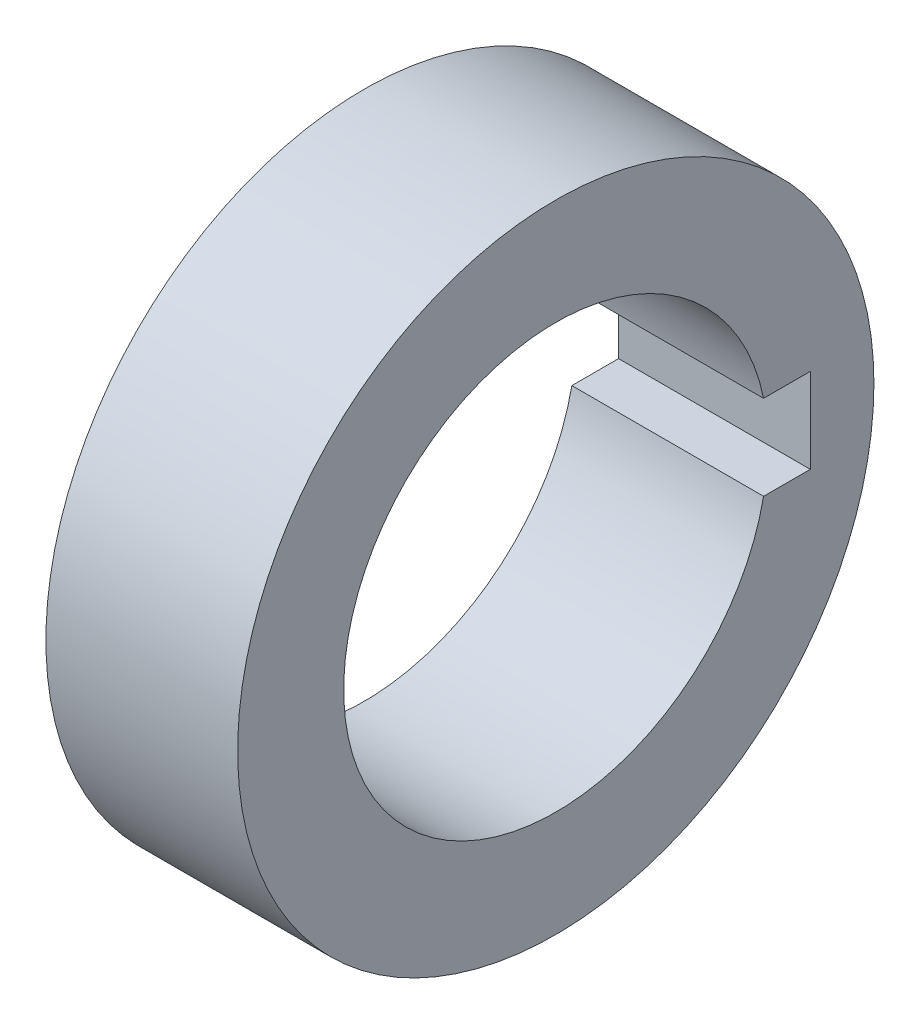
ISO-10303-21;
HEADER;
FILE_DESCRIPTION(('STEP AP214'),'2;1');
FILE_NAME('part.step','',(''),(''),'','','');
FILE_SCHEMA(('AUTOMOTIVE_DESIGN { 1 0 10303 214 1 1 1 1 }'));
ENDSEC;
DATA;
#1=APPLICATION_CONTEXT('core data for automotive mechanical design processes');
#2=APPLICATION_PROTOCOL_DEFINITION('international standard','automotive_design',2000,#1);
#3=PRODUCT_CONTEXT('',#1,'mechanical');
#4=PRODUCT('Part','Part','',(#3));
#5=PRODUCT_RELATED_PRODUCT_CATEGORY('part','',(#4));
#6=PRODUCT_DEFINITION_FORMATION('','',#4);
#7=PRODUCT_DEFINITION_CONTEXT('part definition',#1,'design');
#8=PRODUCT_DEFINITION('design','',#6,#7);
#9=PRODUCT_DEFINITION_SHAPE('','',#8);
#10=(LENGTH_UNIT() NAMED_UNIT(*) SI_UNIT(.MILLI.,.METRE.));
#11=(NAMED_UNIT(*) PLANE_ANGLE_UNIT() SI_UNIT($,.RADIAN.));
#12=(NAMED_UNIT(*) SI_UNIT($,.STERADIAN.) SOLID_ANGLE_UNIT());
#13=UNCERTAINTY_MEASURE_WITH_UNIT(LENGTH_MEASURE(1.E-05),#10,'distance_accuracy_value','');
#14=(GEOMETRIC_REPRESENTATION_CONTEXT(3) GLOBAL_UNCERTAINTY_ASSIGNED_CONTEXT((#13)) GLOBAL_UNIT_ASSIGNED_CONTEXT((#10,
#11,#12)) REPRESENTATION_CONTEXT('',''));
#15=CARTESIAN_POINT('',(0.,0.,0.));
#16=DIRECTION('',(0.,0.,1.));
#17=DIRECTION('',(1.,0.,0.));
#18=AXIS2_PLACEMENT_3D('',#15,#16,#17);
#19=CARTESIAN_POINT('',(-887.349,290.5125,-1549.4));
#20=DIRECTION('',(-1.,0.,0.));
#21=DIRECTION('',(0.,0.,1.));
#22=AXIS2_PLACEMENT_3D('',#19,#20,#21);
#23=CYLINDRICAL_SURFACE('',#22,23.8124999999999);
#24=CARTESIAN_POINT('',(-887.349,290.5125,-1549.4));
#25=DIRECTION('',(1.,0.,0.));
#26=DIRECTION('',(0.,0.,-1.));
#27=AXIS2_PLACEMENT_3D('',#24,#25,#26);
#28=CIRCLE('',#27,23.8124999999999);
#29=CARTESIAN_POINT('',(-887.349,290.5125,-1573.2125));
#30=VERTEX_POINT('',#29);
#31=EDGE_CURVE('E105',#30,#30,#28,.T.);
#32=ORIENTED_EDGE('',*,*,#31,.F.);
#33=EDGE_LOOP('',(#32));
#34=FACE_BOUND('',#33,.T.);
#35=CARTESIAN_POINT('',(-901.7,290.5125,-1549.4));
#36=DIRECTION('',(1.,0.,0.));
#37=DIRECTION('',(0.,0.,-1.));
#38=AXIS2_PLACEMENT_3D('',#35,#36,#37);
#39=CIRCLE('',#38,23.8124999999999);
#40=CARTESIAN_POINT('',(-901.7,290.5125,-1573.2125));
#41=VERTEX_POINT('',#40);
#42=EDGE_CURVE('E11',#41,#41,#39,.F.);
#43=ORIENTED_EDGE('',*,*,#42,.F.);
#44=EDGE_LOOP('',(#43));
#45=FACE_BOUND('',#44,.T.);
#46=ADVANCED_FACE('F37',(#34,#45),#23,.T.);
#47=CARTESIAN_POINT('',(-946.601280605346,290.5125,-1549.4));
#48=DIRECTION('',(1.,0.,0.));
#49=DIRECTION('',(0.,0.,-1.));
#50=AXIS2_PLACEMENT_3D('',#47,#48,#49);
#51=CYLINDRICAL_SURFACE('',#50,15.8750000000002);
#52=CARTESIAN_POINT('',(-901.7,290.5125,-1549.4));
#53=DIRECTION('',(1.,0.,0.));
#54=DIRECTION('',(0.,0.,-1.));
#55=AXIS2_PLACEMENT_3D('',#52,#53,#54);
#56=CIRCLE('',#55,15.8750000000002);
#57=CARTESIAN_POINT('',(-901.7,287.3375,-1564.95425986667));
#58=VERTEX_POINT('',#57);
#59=CARTESIAN_POINT('',(-901.7,293.6875,-1564.95425986667));
#60=VERTEX_POINT('',#59);
#61=EDGE_CURVE('E44',#58,#60,#56,.F.);
#62=ORIENTED_EDGE('',*,*,#61,.T.);
#63=DIRECTION('',(1.,0.,0.));
#64=VECTOR('',#63,1.);
#65=CARTESIAN_POINT('',(-946.601280605346,293.6875,-1564.95425986667));
#66=LINE('',#65,#64);
#67=CARTESIAN_POINT('',(-887.349,293.6875,-1564.95425986667));
#68=VERTEX_POINT('',#67);
#69=EDGE_CURVE('E102',#60,#68,#66,.T.);
#70=ORIENTED_EDGE('',*,*,#69,.T.);
#71=CARTESIAN_POINT('',(-887.349,290.5125,-1549.4));
#72=DIRECTION('',(1.,0.,0.));
#73=DIRECTION('',(0.,0.,-1.));
#74=AXIS2_PLACEMENT_3D('',#71,#72,#73);
#75=CIRCLE('',#74,15.8750000000002);
#76=CARTESIAN_POINT('',(-887.349,287.3375,-1564.95425986667));
#77=VERTEX_POINT('',#76);
#78=EDGE_CURVE('E109',#77,#68,#75,.F.);
#79=ORIENTED_EDGE('',*,*,#78,.F.);
#80=DIRECTION('',(1.,0.,0.));
#81=VECTOR('',#80,1.);
#82=CARTESIAN_POINT('',(-946.601280605346,287.3375,-1564.95425986667));
#83=LINE('',#82,#81);
#84=EDGE_CURVE('E51',#58,#77,#83,.T.);
#85=ORIENTED_EDGE('',*,*,#84,.F.);
#86=EDGE_LOOP('',(#62,#70,#79,#85));
#87=FACE_BOUND('',#86,.T.);
#88=ADVANCED_FACE('F112',(#87),#51,.F.);
#89=CARTESIAN_POINT('',(-910.680256121069,287.3375,0.));
#90=DIRECTION('',(0.,1.,0.));
#91=DIRECTION('',(0.,0.,1.));
#92=AXIS2_PLACEMENT_3D('',#89,#90,#91);
#93=PLANE('',#92);
#94=ORIENTED_EDGE('',*,*,#84,.T.);
#95=DIRECTION('',(0.,0.,1.));
#96=VECTOR('',#95,1.);
#97=CARTESIAN_POINT('',(-887.349,287.3375,0.));
#98=LINE('',#97,#96);
#99=CARTESIAN_POINT('',(-887.349,287.3375,-1568.45));
#100=VERTEX_POINT('',#99);
#101=EDGE_CURVE('E88',#100,#77,#98,.T.);
#102=ORIENTED_EDGE('',*,*,#101,.F.);
#103=DIRECTION('',(1.,0.,0.));
#104=VECTOR('',#103,1.);
#105=CARTESIAN_POINT('',(-910.680256121069,287.3375,-1568.45));
#106=LINE('',#105,#104);
#107=CARTESIAN_POINT('',(-901.7,287.3375,-1568.45));
#108=VERTEX_POINT('',#107);
#109=EDGE_CURVE('E78',#108,#100,#106,.T.);
#110=ORIENTED_EDGE('',*,*,#109,.F.);
#111=DIRECTION('',(0.,0.,-1.));
#112=VECTOR('',#111,1.);
#113=CARTESIAN_POINT('',(-901.7,287.3375,0.));
#114=LINE('',#113,#112);
#115=EDGE_CURVE('E99',#58,#108,#114,.T.);
#116=ORIENTED_EDGE('',*,*,#115,.F.);
#117=EDGE_LOOP('',(#94,#102,#110,#116));
#118=FACE_BOUND('',#117,.T.);
#119=ADVANCED_FACE('F89',(#118),#93,.T.);
#120=CARTESIAN_POINT('',(-910.680256121069,0.,-1568.45));
#121=DIRECTION('',(0.,0.,1.));
#122=DIRECTION('',(1.,0.,0.));
#123=AXIS2_PLACEMENT_3D('',#120,#121,#122);
#124=PLANE('',#123);
#125=ORIENTED_EDGE('',*,*,#109,.T.);
#126=DIRECTION('',(0.,-1.,0.));
#127=VECTOR('',#126,1.);
#128=CARTESIAN_POINT('',(-887.349,0.,-1568.45));
#129=LINE('',#128,#127);
#130=CARTESIAN_POINT('',(-887.349,293.6875,-1568.45));
#131=VERTEX_POINT('',#130);
#132=EDGE_CURVE('E82',#131,#100,#129,.T.);
#133=ORIENTED_EDGE('',*,*,#132,.F.);
#134=DIRECTION('',(1.,0.,0.));
#135=VECTOR('',#134,1.);
#136=CARTESIAN_POINT('',(-910.680256121069,293.6875,-1568.45));
#137=LINE('',#136,#135);
#138=CARTESIAN_POINT('',(-901.7,293.6875,-1568.45));
#139=VERTEX_POINT('',#138);
#140=EDGE_CURVE('E86',#139,#131,#137,.T.);
#141=ORIENTED_EDGE('',*,*,#140,.F.);
#142=DIRECTION('',(0.,1.,0.));
#143=VECTOR('',#142,1.);
#144=CARTESIAN_POINT('',(-901.7,0.,-1568.45));
#145=LINE('',#144,#143);
#146=EDGE_CURVE('E84',#108,#139,#145,.T.);
#147=ORIENTED_EDGE('',*,*,#146,.F.);
#148=EDGE_LOOP('',(#125,#133,#141,#147));
#149=FACE_BOUND('',#148,.T.);
#150=ADVANCED_FACE('F79',(#149),#124,.T.);
#151=CARTESIAN_POINT('',(-910.680256121069,293.6875,0.));
#152=DIRECTION('',(0.,1.,0.));
#153=DIRECTION('',(0.,0.,1.));
#154=AXIS2_PLACEMENT_3D('',#151,#152,#153);
#155=PLANE('',#154);
#156=DIRECTION('',(0.,0.,-1.));
#157=VECTOR('',#156,1.);
#158=CARTESIAN_POINT('',(-901.7,293.6875,0.));
#159=LINE('',#158,#157);
#160=EDGE_CURVE('E103',#60,#139,#159,.T.);
#161=ORIENTED_EDGE('',*,*,#160,.T.);
#162=ORIENTED_EDGE('',*,*,#140,.T.);
#163=DIRECTION('',(0.,0.,1.));
#164=VECTOR('',#163,1.);
#165=CARTESIAN_POINT('',(-887.349,293.6875,0.));
#166=LINE('',#165,#164);
#167=EDGE_CURVE('E59',#131,#68,#166,.T.);
#168=ORIENTED_EDGE('',*,*,#167,.T.);
#169=ORIENTED_EDGE('',*,*,#69,.F.);
#170=EDGE_LOOP('',(#161,#162,#168,#169));
#171=FACE_BOUND('',#170,.T.);
#172=ADVANCED_FACE('F115',(#171),#155,.F.);
#173=CARTESIAN_POINT('',(-887.349,290.5125,-1549.4));
#174=DIRECTION('',(1.,0.,0.));
#175=DIRECTION('',(0.,0.,-1.));
#176=AXIS2_PLACEMENT_3D('',#173,#174,#175);
#177=PLANE('',#176);
#178=ORIENTED_EDGE('',*,*,#167,.F.);
#179=ORIENTED_EDGE('',*,*,#132,.T.);
#180=ORIENTED_EDGE('',*,*,#101,.T.);
#181=ORIENTED_EDGE('',*,*,#78,.T.);
#182=EDGE_LOOP('',(#178,#179,#180,#181));
#183=FACE_BOUND('',#182,.T.);
#184=ORIENTED_EDGE('',*,*,#31,.T.);
#185=EDGE_LOOP('',(#184));
#186=FACE_BOUND('',#185,.T.);
#187=ADVANCED_FACE('F94',(#183,#186),#177,.T.);
#188=CARTESIAN_POINT('',(-901.7,0.,0.));
#189=DIRECTION('',(1.,0.,0.));
#190=DIRECTION('',(0.,0.,-1.));
#191=AXIS2_PLACEMENT_3D('',#188,#189,#190);
#192=PLANE('',#191);
#193=ORIENTED_EDGE('',*,*,#146,.T.);
#194=ORIENTED_EDGE('',*,*,#160,.F.);
#195=ORIENTED_EDGE('',*,*,#61,.F.);
#196=ORIENTED_EDGE('',*,*,#115,.T.);
#197=EDGE_LOOP('',(#193,#194,#195,#196));
#198=FACE_BOUND('',#197,.T.);
#199=ORIENTED_EDGE('',*,*,#42,.T.);
#200=EDGE_LOOP('',(#199));
#201=FACE_BOUND('',#200,.T.);
#202=ADVANCED_FACE('F117',(#198,#201),#192,.F.);
#203=CLOSED_SHELL('',(#46,#88,#119,#150,#172,#187,#202));
#204=MANIFOLD_SOLID_BREP('B2',#203);
#205=ADVANCED_BREP_SHAPE_REPRESENTATION('',(#18,#204),#14);
#206=SHAPE_DEFINITION_REPRESENTATION(#9,#205);
ENDSEC;
END-ISO-10303-21;
